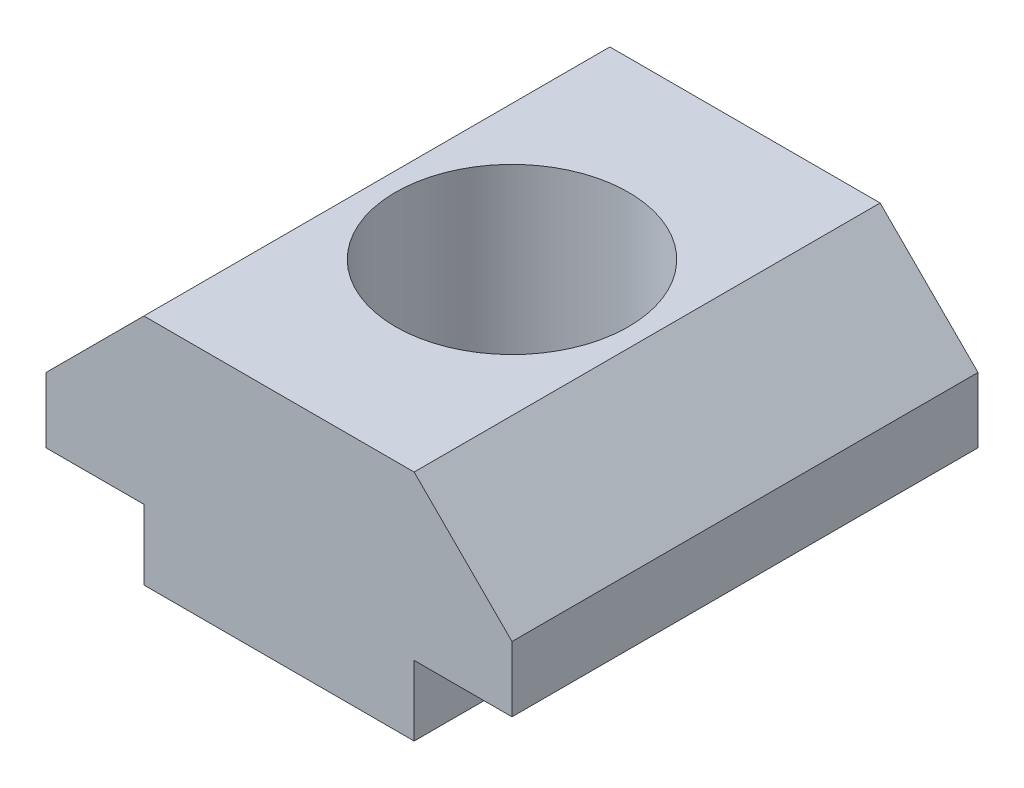
ISO-10303-21;
HEADER;
FILE_DESCRIPTION(('STEP AP214'),'2;1');
FILE_NAME('part.step','',(''),(''),'','','');
FILE_SCHEMA(('AUTOMOTIVE_DESIGN { 1 0 10303 214 1 1 1 1 }'));
ENDSEC;
DATA;
#1=APPLICATION_CONTEXT('core data for automotive mechanical design processes');
#2=APPLICATION_PROTOCOL_DEFINITION('international standard','automotive_design',2000,#1);
#3=PRODUCT_CONTEXT('',#1,'mechanical');
#4=PRODUCT('Part','Part','',(#3));
#5=PRODUCT_RELATED_PRODUCT_CATEGORY('part','',(#4));
#6=PRODUCT_DEFINITION_FORMATION('','',#4);
#7=PRODUCT_DEFINITION_CONTEXT('part definition',#1,'design');
#8=PRODUCT_DEFINITION('design','',#6,#7);
#9=PRODUCT_DEFINITION_SHAPE('','',#8);
#10=(LENGTH_UNIT() NAMED_UNIT(*) SI_UNIT(.MILLI.,.METRE.));
#11=(NAMED_UNIT(*) PLANE_ANGLE_UNIT() SI_UNIT($,.RADIAN.));
#12=(NAMED_UNIT(*) SI_UNIT($,.STERADIAN.) SOLID_ANGLE_UNIT());
#13=UNCERTAINTY_MEASURE_WITH_UNIT(LENGTH_MEASURE(1.E-05),#10,'distance_accuracy_value','');
#14=(GEOMETRIC_REPRESENTATION_CONTEXT(3) GLOBAL_UNCERTAINTY_ASSIGNED_CONTEXT((#13)) GLOBAL_UNIT_ASSIGNED_CONTEXT((#10,
#11,#12)) REPRESENTATION_CONTEXT('',''));
#15=CARTESIAN_POINT('',(0.,0.,0.));
#16=DIRECTION('',(0.,0.,1.));
#17=DIRECTION('',(1.,0.,0.));
#18=AXIS2_PLACEMENT_3D('',#15,#16,#17);
#19=CARTESIAN_POINT('',(-2.9,1.5,-10.));
#20=DIRECTION('',(-1.,0.,0.));
#21=DIRECTION('',(0.,-1.,0.));
#22=AXIS2_PLACEMENT_3D('',#19,#20,#21);
#23=PLANE('',#22);
#24=DIRECTION('',(0.,-1.,0.));
#25=VECTOR('',#24,1.);
#26=CARTESIAN_POINT('',(-2.9,1.5,0.));
#27=LINE('',#26,#25);
#28=CARTESIAN_POINT('',(-2.9,1.5,0.));
#29=VERTEX_POINT('',#28);
#30=CARTESIAN_POINT('',(-2.9,0.,0.));
#31=VERTEX_POINT('',#30);
#32=EDGE_CURVE('E143',#29,#31,#27,.T.);
#33=ORIENTED_EDGE('',*,*,#32,.F.);
#34=DIRECTION('',(0.,0.,1.));
#35=VECTOR('',#34,1.);
#36=CARTESIAN_POINT('',(-2.9,1.5,-10.));
#37=LINE('',#36,#35);
#38=CARTESIAN_POINT('',(-2.9,1.5,-10.));
#39=VERTEX_POINT('',#38);
#40=EDGE_CURVE('E11',#39,#29,#37,.T.);
#41=ORIENTED_EDGE('',*,*,#40,.F.);
#42=DIRECTION('',(0.,-1.,0.));
#43=VECTOR('',#42,1.);
#44=CARTESIAN_POINT('',(-2.9,1.5,-10.));
#45=LINE('',#44,#43);
#46=CARTESIAN_POINT('',(-2.9,0.,-10.));
#47=VERTEX_POINT('',#46);
#48=EDGE_CURVE('E170',#39,#47,#45,.T.);
#49=ORIENTED_EDGE('',*,*,#48,.T.);
#50=DIRECTION('',(0.,0.,1.));
#51=VECTOR('',#50,1.);
#52=CARTESIAN_POINT('',(-2.9,0.,-10.));
#53=LINE('',#52,#51);
#54=EDGE_CURVE('E37',#47,#31,#53,.T.);
#55=ORIENTED_EDGE('',*,*,#54,.T.);
#56=EDGE_LOOP('',(#33,#41,#49,#55));
#57=FACE_BOUND('',#56,.T.);
#58=ADVANCED_FACE('F34',(#57),#23,.T.);
#59=CARTESIAN_POINT('',(-5.,1.5,-10.));
#60=DIRECTION('',(0.,-1.,0.));
#61=DIRECTION('',(0.,0.,-1.));
#62=AXIS2_PLACEMENT_3D('',#59,#60,#61);
#63=PLANE('',#62);
#64=DIRECTION('',(1.,0.,0.));
#65=VECTOR('',#64,1.);
#66=CARTESIAN_POINT('',(-5.,1.5,0.));
#67=LINE('',#66,#65);
#68=CARTESIAN_POINT('',(-5.,1.5,0.));
#69=VERTEX_POINT('',#68);
#70=EDGE_CURVE('E168',#69,#29,#67,.T.);
#71=ORIENTED_EDGE('',*,*,#70,.F.);
#72=DIRECTION('',(0.,0.,1.));
#73=VECTOR('',#72,1.);
#74=CARTESIAN_POINT('',(-5.,1.5,-10.));
#75=LINE('',#74,#73);
#76=CARTESIAN_POINT('',(-5.,1.5,-10.));
#77=VERTEX_POINT('',#76);
#78=EDGE_CURVE('E43',#77,#69,#75,.T.);
#79=ORIENTED_EDGE('',*,*,#78,.F.);
#80=DIRECTION('',(1.,0.,0.));
#81=VECTOR('',#80,1.);
#82=CARTESIAN_POINT('',(-5.,1.5,-10.));
#83=LINE('',#82,#81);
#84=EDGE_CURVE('E133',#77,#39,#83,.T.);
#85=ORIENTED_EDGE('',*,*,#84,.T.);
#86=ORIENTED_EDGE('',*,*,#40,.T.);
#87=EDGE_LOOP('',(#71,#79,#85,#86));
#88=FACE_BOUND('',#87,.T.);
#89=ADVANCED_FACE('F186',(#88),#63,.T.);
#90=CARTESIAN_POINT('',(-5.,2.89999999999999,-10.));
#91=DIRECTION('',(-1.,0.,0.));
#92=DIRECTION('',(0.,-1.,0.));
#93=AXIS2_PLACEMENT_3D('',#90,#91,#92);
#94=PLANE('',#93);
#95=DIRECTION('',(0.,-1.,0.));
#96=VECTOR('',#95,1.);
#97=CARTESIAN_POINT('',(-5.,2.89999999999999,0.));
#98=LINE('',#97,#96);
#99=CARTESIAN_POINT('',(-5.,2.89999999999999,0.));
#100=VERTEX_POINT('',#99);
#101=EDGE_CURVE('E120',#100,#69,#98,.T.);
#102=ORIENTED_EDGE('',*,*,#101,.F.);
#103=DIRECTION('',(0.,0.,1.));
#104=VECTOR('',#103,1.);
#105=CARTESIAN_POINT('',(-5.,2.89999999999999,-10.));
#106=LINE('',#105,#104);
#107=CARTESIAN_POINT('',(-5.,2.89999999999999,-10.));
#108=VERTEX_POINT('',#107);
#109=EDGE_CURVE('E115',#108,#100,#106,.T.);
#110=ORIENTED_EDGE('',*,*,#109,.F.);
#111=DIRECTION('',(0.,-1.,0.));
#112=VECTOR('',#111,1.);
#113=CARTESIAN_POINT('',(-5.,2.89999999999999,-10.));
#114=LINE('',#113,#112);
#115=EDGE_CURVE('E118',#108,#77,#114,.T.);
#116=ORIENTED_EDGE('',*,*,#115,.T.);
#117=ORIENTED_EDGE('',*,*,#78,.T.);
#118=EDGE_LOOP('',(#102,#110,#116,#117));
#119=FACE_BOUND('',#118,.T.);
#120=ADVANCED_FACE('F117',(#119),#94,.T.);
#121=CARTESIAN_POINT('',(-2.9,5.,-10.));
#122=DIRECTION('',(-0.707106781186549,0.707106781186546,0.));
#123=DIRECTION('',(-0.707106781186546,-0.707106781186549,0.));
#124=AXIS2_PLACEMENT_3D('',#121,#122,#123);
#125=PLANE('',#124);
#126=DIRECTION('',(-0.707106781186546,-0.707106781186549,0.));
#127=VECTOR('',#126,1.);
#128=CARTESIAN_POINT('',(-2.9,5.,0.));
#129=LINE('',#128,#127);
#130=CARTESIAN_POINT('',(-2.9,5.,0.));
#131=VERTEX_POINT('',#130);
#132=EDGE_CURVE('E165',#131,#100,#129,.T.);
#133=ORIENTED_EDGE('',*,*,#132,.F.);
#134=DIRECTION('',(0.,0.,1.));
#135=VECTOR('',#134,1.);
#136=CARTESIAN_POINT('',(-2.9,5.,-10.));
#137=LINE('',#136,#135);
#138=CARTESIAN_POINT('',(-2.9,5.,-10.));
#139=VERTEX_POINT('',#138);
#140=EDGE_CURVE('E125',#139,#131,#137,.T.);
#141=ORIENTED_EDGE('',*,*,#140,.F.);
#142=DIRECTION('',(-0.707106781186546,-0.707106781186549,0.));
#143=VECTOR('',#142,1.);
#144=CARTESIAN_POINT('',(-2.9,5.,-10.));
#145=LINE('',#144,#143);
#146=EDGE_CURVE('E131',#139,#108,#145,.T.);
#147=ORIENTED_EDGE('',*,*,#146,.T.);
#148=ORIENTED_EDGE('',*,*,#109,.T.);
#149=EDGE_LOOP('',(#133,#141,#147,#148));
#150=FACE_BOUND('',#149,.T.);
#151=ADVANCED_FACE('F135',(#150),#125,.T.);
#152=CARTESIAN_POINT('',(2.9,5.,-10.));
#153=DIRECTION('',(0.,1.,0.));
#154=DIRECTION('',(0.,0.,1.));
#155=AXIS2_PLACEMENT_3D('',#152,#153,#154);
#156=PLANE('',#155);
#157=CARTESIAN_POINT('',(0.,5.,-4.99999999999773));
#158=DIRECTION('',(0.,1.,0.));
#159=DIRECTION('',(0.,0.,1.));
#160=AXIS2_PLACEMENT_3D('',#157,#158,#159);
#161=CIRCLE('',#160,2.5);
#162=CARTESIAN_POINT('',(0.,5.,-2.49999999999773));
#163=VERTEX_POINT('',#162);
#164=EDGE_CURVE('E226',#163,#163,#161,.T.);
#165=ORIENTED_EDGE('',*,*,#164,.F.);
#166=EDGE_LOOP('',(#165));
#167=FACE_BOUND('',#166,.T.);
#168=DIRECTION('',(-1.,0.,0.));
#169=VECTOR('',#168,1.);
#170=CARTESIAN_POINT('',(2.9,5.,0.));
#171=LINE('',#170,#169);
#172=CARTESIAN_POINT('',(2.9,5.,0.));
#173=VERTEX_POINT('',#172);
#174=EDGE_CURVE('E162',#173,#131,#171,.T.);
#175=ORIENTED_EDGE('',*,*,#174,.F.);
#176=DIRECTION('',(0.,0.,1.));
#177=VECTOR('',#176,1.);
#178=CARTESIAN_POINT('',(2.9,5.,-10.));
#179=LINE('',#178,#177);
#180=CARTESIAN_POINT('',(2.9,5.,-10.));
#181=VERTEX_POINT('',#180);
#182=EDGE_CURVE('E174',#181,#173,#179,.T.);
#183=ORIENTED_EDGE('',*,*,#182,.F.);
#184=DIRECTION('',(-1.,0.,0.));
#185=VECTOR('',#184,1.);
#186=CARTESIAN_POINT('',(2.9,5.,-10.));
#187=LINE('',#186,#185);
#188=EDGE_CURVE('E136',#181,#139,#187,.T.);
#189=ORIENTED_EDGE('',*,*,#188,.T.);
#190=ORIENTED_EDGE('',*,*,#140,.T.);
#191=EDGE_LOOP('',(#175,#183,#189,#190));
#192=FACE_BOUND('',#191,.T.);
#193=ADVANCED_FACE('F199',(#167,#192),#156,.T.);
#194=CARTESIAN_POINT('',(5.,2.89999999999999,-10.));
#195=DIRECTION('',(0.707106781186549,0.707106781186546,0.));
#196=DIRECTION('',(-0.707106781186546,0.707106781186549,0.));
#197=AXIS2_PLACEMENT_3D('',#194,#195,#196);
#198=PLANE('',#197);
#199=DIRECTION('',(-0.707106781186546,0.707106781186549,0.));
#200=VECTOR('',#199,1.);
#201=CARTESIAN_POINT('',(5.,2.89999999999999,0.));
#202=LINE('',#201,#200);
#203=CARTESIAN_POINT('',(5.,2.89999999999999,0.));
#204=VERTEX_POINT('',#203);
#205=EDGE_CURVE('E159',#204,#173,#202,.T.);
#206=ORIENTED_EDGE('',*,*,#205,.F.);
#207=DIRECTION('',(0.,0.,1.));
#208=VECTOR('',#207,1.);
#209=CARTESIAN_POINT('',(5.,2.89999999999999,-10.));
#210=LINE('',#209,#208);
#211=CARTESIAN_POINT('',(5.,2.89999999999999,-10.));
#212=VERTEX_POINT('',#211);
#213=EDGE_CURVE('E176',#212,#204,#210,.T.);
#214=ORIENTED_EDGE('',*,*,#213,.F.);
#215=DIRECTION('',(-0.707106781186546,0.707106781186549,0.));
#216=VECTOR('',#215,1.);
#217=CARTESIAN_POINT('',(5.,2.89999999999999,-10.));
#218=LINE('',#217,#216);
#219=EDGE_CURVE('E138',#212,#181,#218,.T.);
#220=ORIENTED_EDGE('',*,*,#219,.T.);
#221=ORIENTED_EDGE('',*,*,#182,.T.);
#222=EDGE_LOOP('',(#206,#214,#220,#221));
#223=FACE_BOUND('',#222,.T.);
#224=ADVANCED_FACE('F202',(#223),#198,.T.);
#225=CARTESIAN_POINT('',(5.,1.5,-10.));
#226=DIRECTION('',(1.,0.,0.));
#227=DIRECTION('',(0.,0.,-1.));
#228=AXIS2_PLACEMENT_3D('',#225,#226,#227);
#229=PLANE('',#228);
#230=DIRECTION('',(0.,1.,0.));
#231=VECTOR('',#230,1.);
#232=CARTESIAN_POINT('',(5.,1.5,0.));
#233=LINE('',#232,#231);
#234=CARTESIAN_POINT('',(5.,1.5,0.));
#235=VERTEX_POINT('',#234);
#236=EDGE_CURVE('E156',#235,#204,#233,.T.);
#237=ORIENTED_EDGE('',*,*,#236,.F.);
#238=DIRECTION('',(0.,0.,1.));
#239=VECTOR('',#238,1.);
#240=CARTESIAN_POINT('',(5.,1.5,-10.));
#241=LINE('',#240,#239);
#242=CARTESIAN_POINT('',(5.,1.5,-10.));
#243=VERTEX_POINT('',#242);
#244=EDGE_CURVE('E178',#243,#235,#241,.T.);
#245=ORIENTED_EDGE('',*,*,#244,.F.);
#246=DIRECTION('',(0.,1.,0.));
#247=VECTOR('',#246,1.);
#248=CARTESIAN_POINT('',(5.,1.5,-10.));
#249=LINE('',#248,#247);
#250=EDGE_CURVE('E240',#243,#212,#249,.T.);
#251=ORIENTED_EDGE('',*,*,#250,.T.);
#252=ORIENTED_EDGE('',*,*,#213,.T.);
#253=EDGE_LOOP('',(#237,#245,#251,#252));
#254=FACE_BOUND('',#253,.T.);
#255=ADVANCED_FACE('F206',(#254),#229,.T.);
#256=CARTESIAN_POINT('',(2.9,1.5,-10.));
#257=DIRECTION('',(0.,-1.,0.));
#258=DIRECTION('',(1.,0.,0.));
#259=AXIS2_PLACEMENT_3D('',#256,#257,#258);
#260=PLANE('',#259);
#261=DIRECTION('',(1.,0.,0.));
#262=VECTOR('',#261,1.);
#263=CARTESIAN_POINT('',(2.9,1.5,0.));
#264=LINE('',#263,#262);
#265=CARTESIAN_POINT('',(2.9,1.5,0.));
#266=VERTEX_POINT('',#265);
#267=EDGE_CURVE('E153',#266,#235,#264,.T.);
#268=ORIENTED_EDGE('',*,*,#267,.F.);
#269=DIRECTION('',(0.,0.,1.));
#270=VECTOR('',#269,1.);
#271=CARTESIAN_POINT('',(2.9,1.5,-10.));
#272=LINE('',#271,#270);
#273=CARTESIAN_POINT('',(2.9,1.5,-10.));
#274=VERTEX_POINT('',#273);
#275=EDGE_CURVE('E180',#274,#266,#272,.T.);
#276=ORIENTED_EDGE('',*,*,#275,.F.);
#277=DIRECTION('',(1.,0.,0.));
#278=VECTOR('',#277,1.);
#279=CARTESIAN_POINT('',(2.9,1.5,-10.));
#280=LINE('',#279,#278);
#281=EDGE_CURVE('E237',#274,#243,#280,.T.);
#282=ORIENTED_EDGE('',*,*,#281,.T.);
#283=ORIENTED_EDGE('',*,*,#244,.T.);
#284=EDGE_LOOP('',(#268,#276,#282,#283));
#285=FACE_BOUND('',#284,.T.);
#286=ADVANCED_FACE('F210',(#285),#260,.T.);
#287=CARTESIAN_POINT('',(2.9,0.,-10.));
#288=DIRECTION('',(1.,0.,0.));
#289=DIRECTION('',(0.,0.,-1.));
#290=AXIS2_PLACEMENT_3D('',#287,#288,#289);
#291=PLANE('',#290);
#292=DIRECTION('',(0.,1.,0.));
#293=VECTOR('',#292,1.);
#294=CARTESIAN_POINT('',(2.9,0.,0.));
#295=LINE('',#294,#293);
#296=CARTESIAN_POINT('',(2.9,0.,0.));
#297=VERTEX_POINT('',#296);
#298=EDGE_CURVE('E150',#297,#266,#295,.T.);
#299=ORIENTED_EDGE('',*,*,#298,.F.);
#300=DIRECTION('',(0.,0.,1.));
#301=VECTOR('',#300,1.);
#302=CARTESIAN_POINT('',(2.9,0.,-10.));
#303=LINE('',#302,#301);
#304=CARTESIAN_POINT('',(2.9,0.,-10.));
#305=VERTEX_POINT('',#304);
#306=EDGE_CURVE('E181',#305,#297,#303,.T.);
#307=ORIENTED_EDGE('',*,*,#306,.F.);
#308=DIRECTION('',(0.,1.,0.));
#309=VECTOR('',#308,1.);
#310=CARTESIAN_POINT('',(2.9,0.,-10.));
#311=LINE('',#310,#309);
#312=EDGE_CURVE('E234',#305,#274,#311,.T.);
#313=ORIENTED_EDGE('',*,*,#312,.T.);
#314=ORIENTED_EDGE('',*,*,#275,.T.);
#315=EDGE_LOOP('',(#299,#307,#313,#314));
#316=FACE_BOUND('',#315,.T.);
#317=ADVANCED_FACE('F214',(#316),#291,.T.);
#318=CARTESIAN_POINT('',(-2.9,0.,-10.));
#319=DIRECTION('',(0.,-1.,0.));
#320=DIRECTION('',(0.,0.,-1.));
#321=AXIS2_PLACEMENT_3D('',#318,#319,#320);
#322=PLANE('',#321);
#323=CARTESIAN_POINT('',(0.,0.,-4.99999999999773));
#324=DIRECTION('',(0.,1.,0.));
#325=DIRECTION('',(0.,0.,1.));
#326=AXIS2_PLACEMENT_3D('',#323,#324,#325);
#327=CIRCLE('',#326,2.5);
#328=CARTESIAN_POINT('',(0.,0.,-2.49999999999773));
#329=VERTEX_POINT('',#328);
#330=EDGE_CURVE('E147',#329,#329,#327,.T.);
#331=ORIENTED_EDGE('',*,*,#330,.T.);
#332=EDGE_LOOP('',(#331));
#333=FACE_BOUND('',#332,.T.);
#334=DIRECTION('',(1.,0.,0.));
#335=VECTOR('',#334,1.);
#336=CARTESIAN_POINT('',(-2.9,0.,0.));
#337=LINE('',#336,#335);
#338=EDGE_CURVE('E146',#31,#297,#337,.T.);
#339=ORIENTED_EDGE('',*,*,#338,.F.);
#340=ORIENTED_EDGE('',*,*,#54,.F.);
#341=DIRECTION('',(1.,0.,0.));
#342=VECTOR('',#341,1.);
#343=CARTESIAN_POINT('',(-2.9,0.,-10.));
#344=LINE('',#343,#342);
#345=EDGE_CURVE('E232',#47,#305,#344,.T.);
#346=ORIENTED_EDGE('',*,*,#345,.T.);
#347=ORIENTED_EDGE('',*,*,#306,.T.);
#348=EDGE_LOOP('',(#339,#340,#346,#347));
#349=FACE_BOUND('',#348,.T.);
#350=ADVANCED_FACE('F183',(#333,#349),#322,.T.);
#351=CARTESIAN_POINT('',(0.,0.,-10.));
#352=DIRECTION('',(0.,0.,1.));
#353=DIRECTION('',(1.,0.,0.));
#354=AXIS2_PLACEMENT_3D('',#351,#352,#353);
#355=PLANE('',#354);
#356=ORIENTED_EDGE('',*,*,#48,.F.);
#357=ORIENTED_EDGE('',*,*,#84,.F.);
#358=ORIENTED_EDGE('',*,*,#115,.F.);
#359=ORIENTED_EDGE('',*,*,#146,.F.);
#360=ORIENTED_EDGE('',*,*,#188,.F.);
#361=ORIENTED_EDGE('',*,*,#219,.F.);
#362=ORIENTED_EDGE('',*,*,#250,.F.);
#363=ORIENTED_EDGE('',*,*,#281,.F.);
#364=ORIENTED_EDGE('',*,*,#312,.F.);
#365=ORIENTED_EDGE('',*,*,#345,.F.);
#366=EDGE_LOOP('',(#356,#357,#358,#359,#360,#361,#362,#363,#364,#365));
#367=FACE_BOUND('',#366,.T.);
#368=ADVANCED_FACE('F129',(#367),#355,.F.);
#369=CARTESIAN_POINT('',(0.,0.,0.));
#370=DIRECTION('',(0.,0.,1.));
#371=DIRECTION('',(1.,0.,0.));
#372=AXIS2_PLACEMENT_3D('',#369,#370,#371);
#373=PLANE('',#372);
#374=ORIENTED_EDGE('',*,*,#32,.T.);
#375=ORIENTED_EDGE('',*,*,#338,.T.);
#376=ORIENTED_EDGE('',*,*,#298,.T.);
#377=ORIENTED_EDGE('',*,*,#267,.T.);
#378=ORIENTED_EDGE('',*,*,#236,.T.);
#379=ORIENTED_EDGE('',*,*,#205,.T.);
#380=ORIENTED_EDGE('',*,*,#174,.T.);
#381=ORIENTED_EDGE('',*,*,#132,.T.);
#382=ORIENTED_EDGE('',*,*,#101,.T.);
#383=ORIENTED_EDGE('',*,*,#70,.T.);
#384=EDGE_LOOP('',(#374,#375,#376,#377,#378,#379,#380,#381,#382,#383));
#385=FACE_BOUND('',#384,.T.);
#386=ADVANCED_FACE('F185',(#385),#373,.T.);
#387=CARTESIAN_POINT('',(0.,0.,-4.99999999999773));
#388=DIRECTION('',(0.,1.,0.));
#389=DIRECTION('',(0.,0.,1.));
#390=AXIS2_PLACEMENT_3D('',#387,#388,#389);
#391=CYLINDRICAL_SURFACE('',#390,2.5);
#392=ORIENTED_EDGE('',*,*,#330,.F.);
#393=EDGE_LOOP('',(#392));
#394=FACE_BOUND('',#393,.T.);
#395=ORIENTED_EDGE('',*,*,#164,.T.);
#396=EDGE_LOOP('',(#395));
#397=FACE_BOUND('',#396,.T.);
#398=ADVANCED_FACE('F254',(#394,#397),#391,.F.);
#399=CLOSED_SHELL('',(#58,#89,#120,#151,#193,#224,#255,#286,#317,#350,#368,#386,#398));
#400=MANIFOLD_SOLID_BREP('B2',#399);
#401=ADVANCED_BREP_SHAPE_REPRESENTATION('',(#18,#400),#14);
#402=SHAPE_DEFINITION_REPRESENTATION(#9,#401);
ENDSEC;
END-ISO-10303-21;
